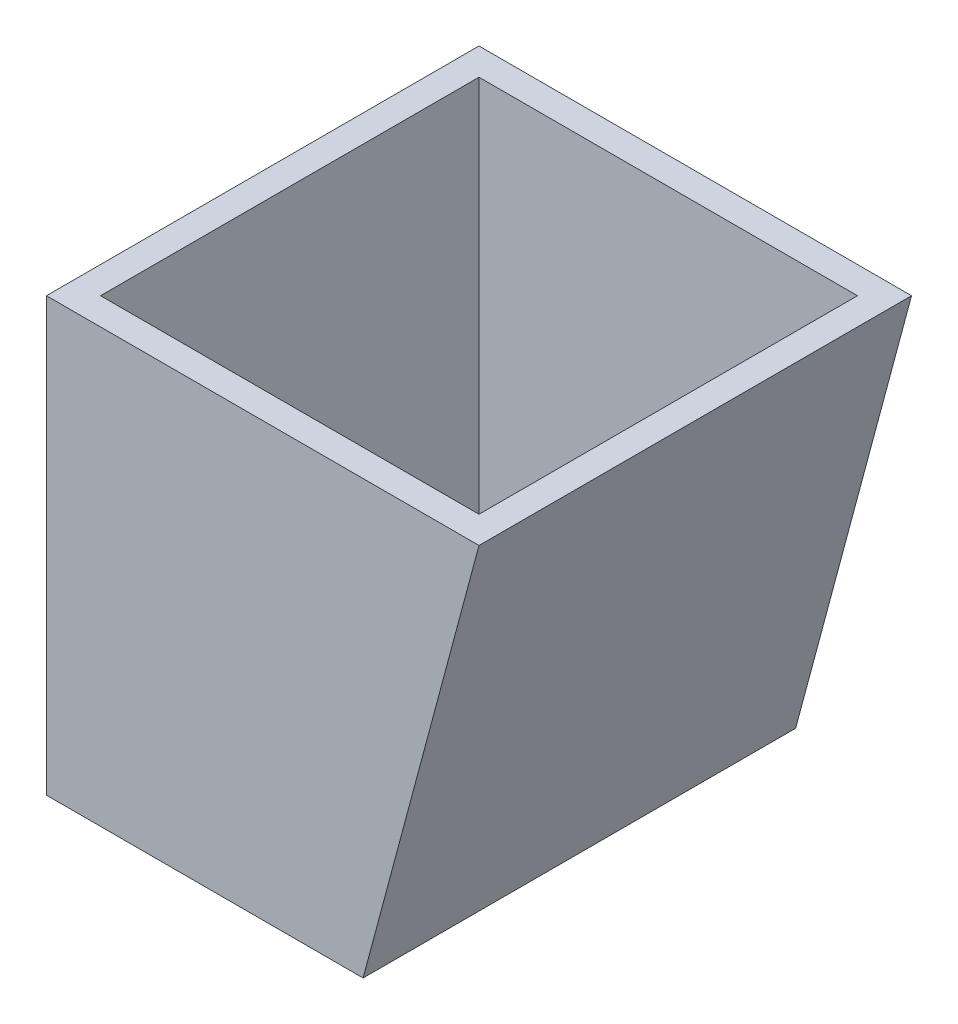
ISO-10303-21;
HEADER;
FILE_DESCRIPTION(('STEP AP214'),'2;1');
FILE_NAME('part.step','',(''),(''),'','','');
FILE_SCHEMA(('AUTOMOTIVE_DESIGN { 1 0 10303 214 1 1 1 1 }'));
ENDSEC;
DATA;
#1=APPLICATION_CONTEXT('core data for automotive mechanical design processes');
#2=APPLICATION_PROTOCOL_DEFINITION('international standard','automotive_design',2000,#1);
#3=PRODUCT_CONTEXT('',#1,'mechanical');
#4=PRODUCT('Part','Part','',(#3));
#5=PRODUCT_RELATED_PRODUCT_CATEGORY('part','',(#4));
#6=PRODUCT_DEFINITION_FORMATION('','',#4);
#7=PRODUCT_DEFINITION_CONTEXT('part definition',#1,'design');
#8=PRODUCT_DEFINITION('design','',#6,#7);
#9=PRODUCT_DEFINITION_SHAPE('','',#8);
#10=(LENGTH_UNIT() NAMED_UNIT(*) SI_UNIT(.MILLI.,.METRE.));
#11=(NAMED_UNIT(*) PLANE_ANGLE_UNIT() SI_UNIT($,.RADIAN.));
#12=(NAMED_UNIT(*) SI_UNIT($,.STERADIAN.) SOLID_ANGLE_UNIT());
#13=UNCERTAINTY_MEASURE_WITH_UNIT(LENGTH_MEASURE(1.E-05),#10,'distance_accuracy_value','');
#14=(GEOMETRIC_REPRESENTATION_CONTEXT(3) GLOBAL_UNCERTAINTY_ASSIGNED_CONTEXT((#13)) GLOBAL_UNIT_ASSIGNED_CONTEXT((#10,
#11,#12)) REPRESENTATION_CONTEXT('',''));
#15=CARTESIAN_POINT('',(0.,0.,0.));
#16=DIRECTION('',(0.,0.,1.));
#17=DIRECTION('',(1.,0.,0.));
#18=AXIS2_PLACEMENT_3D('',#15,#16,#17);
#19=CARTESIAN_POINT('',(-25.4,50.8,-25.4));
#20=DIRECTION('',(0.,0.,1.));
#21=DIRECTION('',(1.,0.,0.));
#22=AXIS2_PLACEMENT_3D('',#19,#20,#21);
#23=PLANE('',#22);
#24=DIRECTION('',(-1.,0.,0.));
#25=VECTOR('',#24,1.);
#26=CARTESIAN_POINT('',(-25.4,50.8,-25.4));
#27=LINE('',#26,#25);
#28=CARTESIAN_POINT('',(25.4,50.8,-25.4));
#29=VERTEX_POINT('',#28);
#30=CARTESIAN_POINT('',(-25.4,50.8,-25.4));
#31=VERTEX_POINT('',#30);
#32=EDGE_CURVE('E145',#29,#31,#27,.T.);
#33=ORIENTED_EDGE('',*,*,#32,.F.);
#34=DIRECTION('',(-0.258819045102521,-0.965925826289068,0.));
#35=VECTOR('',#34,1.);
#36=CARTESIAN_POINT('',(11.7881810244989,0.,-25.4));
#37=LINE('',#36,#35);
#38=CARTESIAN_POINT('',(11.7881810244989,0.,-25.4));
#39=VERTEX_POINT('',#38);
#40=EDGE_CURVE('E134',#29,#39,#37,.T.);
#41=ORIENTED_EDGE('',*,*,#40,.T.);
#42=DIRECTION('',(-1.,0.,0.));
#43=VECTOR('',#42,1.);
#44=CARTESIAN_POINT('',(-25.4,0.,-25.4));
#45=LINE('',#44,#43);
#46=CARTESIAN_POINT('',(-25.4,0.,-25.4));
#47=VERTEX_POINT('',#46);
#48=EDGE_CURVE('E142',#39,#47,#45,.T.);
#49=ORIENTED_EDGE('',*,*,#48,.T.);
#50=DIRECTION('',(0.,-1.,0.));
#51=VECTOR('',#50,1.);
#52=CARTESIAN_POINT('',(-25.4,50.8,-25.4));
#53=LINE('',#52,#51);
#54=EDGE_CURVE('E44',#31,#47,#53,.T.);
#55=ORIENTED_EDGE('',*,*,#54,.F.);
#56=EDGE_LOOP('',(#33,#41,#49,#55));
#57=FACE_BOUND('',#56,.T.);
#58=ADVANCED_FACE('F37',(#57),#23,.F.);
#59=CARTESIAN_POINT('',(-25.4,50.8,-25.4));
#60=DIRECTION('',(1.,0.,0.));
#61=DIRECTION('',(0.,0.,-1.));
#62=AXIS2_PLACEMENT_3D('',#59,#60,#61);
#63=PLANE('',#62);
#64=DIRECTION('',(0.,0.,1.));
#65=VECTOR('',#64,1.);
#66=CARTESIAN_POINT('',(-25.4,0.,-25.4));
#67=LINE('',#66,#65);
#68=CARTESIAN_POINT('',(-25.4,0.,25.4));
#69=VERTEX_POINT('',#68);
#70=EDGE_CURVE('E154',#47,#69,#67,.T.);
#71=ORIENTED_EDGE('',*,*,#70,.T.);
#72=DIRECTION('',(0.,-1.,0.));
#73=VECTOR('',#72,1.);
#74=CARTESIAN_POINT('',(-25.4,50.8,25.4));
#75=LINE('',#74,#73);
#76=CARTESIAN_POINT('',(-25.4,50.8,25.4));
#77=VERTEX_POINT('',#76);
#78=EDGE_CURVE('E152',#77,#69,#75,.T.);
#79=ORIENTED_EDGE('',*,*,#78,.F.);
#80=DIRECTION('',(0.,0.,1.));
#81=VECTOR('',#80,1.);
#82=CARTESIAN_POINT('',(-25.4,50.8,-25.4));
#83=LINE('',#82,#81);
#84=EDGE_CURVE('E148',#31,#77,#83,.T.);
#85=ORIENTED_EDGE('',*,*,#84,.F.);
#86=ORIENTED_EDGE('',*,*,#54,.T.);
#87=EDGE_LOOP('',(#71,#79,#85,#86));
#88=FACE_BOUND('',#87,.T.);
#89=ADVANCED_FACE('F163',(#88),#63,.F.);
#90=CARTESIAN_POINT('',(-25.4,50.8,25.4));
#91=DIRECTION('',(0.,0.,-1.));
#92=DIRECTION('',(-1.,0.,0.));
#93=AXIS2_PLACEMENT_3D('',#90,#91,#92);
#94=PLANE('',#93);
#95=DIRECTION('',(1.,0.,0.));
#96=VECTOR('',#95,1.);
#97=CARTESIAN_POINT('',(-25.4,0.,25.4));
#98=LINE('',#97,#96);
#99=CARTESIAN_POINT('',(11.7881810244989,0.,25.4));
#100=VERTEX_POINT('',#99);
#101=EDGE_CURVE('E146',#69,#100,#98,.T.);
#102=ORIENTED_EDGE('',*,*,#101,.T.);
#103=DIRECTION('',(-0.258819045102521,-0.965925826289068,0.));
#104=VECTOR('',#103,1.);
#105=CARTESIAN_POINT('',(11.7881810244989,0.,25.4));
#106=LINE('',#105,#104);
#107=CARTESIAN_POINT('',(25.4,50.8,25.4));
#108=VERTEX_POINT('',#107);
#109=EDGE_CURVE('E132',#108,#100,#106,.T.);
#110=ORIENTED_EDGE('',*,*,#109,.F.);
#111=DIRECTION('',(1.,0.,0.));
#112=VECTOR('',#111,1.);
#113=CARTESIAN_POINT('',(-25.4,50.8,25.4));
#114=LINE('',#113,#112);
#115=EDGE_CURVE('E150',#77,#108,#114,.T.);
#116=ORIENTED_EDGE('',*,*,#115,.F.);
#117=ORIENTED_EDGE('',*,*,#78,.T.);
#118=EDGE_LOOP('',(#102,#110,#116,#117));
#119=FACE_BOUND('',#118,.T.);
#120=ADVANCED_FACE('F173',(#119),#94,.F.);
#121=CARTESIAN_POINT('',(0.,50.8,0.));
#122=DIRECTION('',(0.,1.,0.));
#123=DIRECTION('',(0.,0.,1.));
#124=AXIS2_PLACEMENT_3D('',#121,#122,#123);
#125=PLANE('',#124);
#126=ORIENTED_EDGE('',*,*,#115,.T.);
#127=DIRECTION('',(0.,0.,-1.));
#128=VECTOR('',#127,1.);
#129=CARTESIAN_POINT('',(25.4,50.8,-25.4));
#130=LINE('',#129,#128);
#131=EDGE_CURVE('E143',#108,#29,#130,.T.);
#132=ORIENTED_EDGE('',*,*,#131,.T.);
#133=ORIENTED_EDGE('',*,*,#32,.T.);
#134=ORIENTED_EDGE('',*,*,#84,.T.);
#135=EDGE_LOOP('',(#126,#132,#133,#134));
#136=FACE_BOUND('',#135,.T.);
#137=DIRECTION('',(0.,0.,-1.));
#138=VECTOR('',#137,1.);
#139=CARTESIAN_POINT('',(22.225,50.8,-22.225));
#140=LINE('',#139,#138);
#141=CARTESIAN_POINT('',(22.225,50.8,22.225));
#142=VERTEX_POINT('',#141);
#143=CARTESIAN_POINT('',(22.225,50.8,-22.225));
#144=VERTEX_POINT('',#143);
#145=EDGE_CURVE('E115',#142,#144,#140,.T.);
#146=ORIENTED_EDGE('',*,*,#145,.F.);
#147=DIRECTION('',(1.,0.,0.));
#148=VECTOR('',#147,1.);
#149=CARTESIAN_POINT('',(-22.225,50.8,22.225));
#150=LINE('',#149,#148);
#151=CARTESIAN_POINT('',(-22.225,50.8,22.225));
#152=VERTEX_POINT('',#151);
#153=EDGE_CURVE('E111',#152,#142,#150,.T.);
#154=ORIENTED_EDGE('',*,*,#153,.F.);
#155=DIRECTION('',(0.,0.,1.));
#156=VECTOR('',#155,1.);
#157=CARTESIAN_POINT('',(-22.225,50.8,-22.225));
#158=LINE('',#157,#156);
#159=CARTESIAN_POINT('',(-22.225,50.8,-22.225));
#160=VERTEX_POINT('',#159);
#161=EDGE_CURVE('E126',#160,#152,#158,.T.);
#162=ORIENTED_EDGE('',*,*,#161,.F.);
#163=DIRECTION('',(-1.,0.,0.));
#164=VECTOR('',#163,1.);
#165=CARTESIAN_POINT('',(-22.225,50.8,-22.225));
#166=LINE('',#165,#164);
#167=EDGE_CURVE('E124',#144,#160,#166,.T.);
#168=ORIENTED_EDGE('',*,*,#167,.F.);
#169=EDGE_LOOP('',(#146,#154,#162,#168));
#170=FACE_BOUND('',#169,.T.);
#171=ADVANCED_FACE('F177',(#136,#170),#125,.T.);
#172=CARTESIAN_POINT('',(0.,0.,0.));
#173=DIRECTION('',(0.,1.,0.));
#174=DIRECTION('',(0.,0.,1.));
#175=AXIS2_PLACEMENT_3D('',#172,#173,#174);
#176=PLANE('',#175);
#177=DIRECTION('',(0.,0.,1.));
#178=VECTOR('',#177,1.);
#179=CARTESIAN_POINT('',(11.7881810244989,0.,-25.4));
#180=LINE('',#179,#178);
#181=EDGE_CURVE('E137',#39,#100,#180,.T.);
#182=ORIENTED_EDGE('',*,*,#181,.T.);
#183=ORIENTED_EDGE('',*,*,#101,.F.);
#184=ORIENTED_EDGE('',*,*,#70,.F.);
#185=ORIENTED_EDGE('',*,*,#48,.F.);
#186=EDGE_LOOP('',(#182,#183,#184,#185));
#187=FACE_BOUND('',#186,.T.);
#188=ADVANCED_FACE('F170',(#187),#176,.F.);
#189=CARTESIAN_POINT('',(11.7881810244989,0.,-25.4));
#190=DIRECTION('',(-0.965925826289068,0.258819045102521,0.));
#191=DIRECTION('',(-0.258819045102521,-0.965925826289068,0.));
#192=AXIS2_PLACEMENT_3D('',#189,#190,#191);
#193=PLANE('',#192);
#194=ORIENTED_EDGE('',*,*,#40,.F.);
#195=ORIENTED_EDGE('',*,*,#131,.F.);
#196=ORIENTED_EDGE('',*,*,#109,.T.);
#197=ORIENTED_EDGE('',*,*,#181,.F.);
#198=EDGE_LOOP('',(#194,#195,#196,#197));
#199=FACE_BOUND('',#198,.T.);
#200=ADVANCED_FACE('F181',(#199),#193,.F.);
#201=CARTESIAN_POINT('',(-22.225,3.175,22.225));
#202=DIRECTION('',(0.,0.,1.));
#203=DIRECTION('',(1.,0.,0.));
#204=AXIS2_PLACEMENT_3D('',#201,#202,#203);
#205=PLANE('',#204);
#206=ORIENTED_EDGE('',*,*,#153,.T.);
#207=DIRECTION('',(-0.258819045102521,-0.965925826289068,0.));
#208=VECTOR('',#207,1.);
#209=CARTESIAN_POINT('',(7.34116459910912,-4.74722992761695,22.225));
#210=LINE('',#209,#208);
#211=CARTESIAN_POINT('',(9.46391971046776,3.175,22.225));
#212=VERTEX_POINT('',#211);
#213=EDGE_CURVE('E108',#142,#212,#210,.T.);
#214=ORIENTED_EDGE('',*,*,#213,.T.);
#215=DIRECTION('',(1.,0.,0.));
#216=VECTOR('',#215,1.);
#217=CARTESIAN_POINT('',(-22.225,3.175,22.225));
#218=LINE('',#217,#216);
#219=CARTESIAN_POINT('',(-22.225,3.175,22.225));
#220=VERTEX_POINT('',#219);
#221=EDGE_CURVE('E99',#220,#212,#218,.T.);
#222=ORIENTED_EDGE('',*,*,#221,.F.);
#223=DIRECTION('',(0.,1.,0.));
#224=VECTOR('',#223,1.);
#225=CARTESIAN_POINT('',(-22.225,3.175,22.225));
#226=LINE('',#225,#224);
#227=EDGE_CURVE('E130',#220,#152,#226,.T.);
#228=ORIENTED_EDGE('',*,*,#227,.T.);
#229=EDGE_LOOP('',(#206,#214,#222,#228));
#230=FACE_BOUND('',#229,.T.);
#231=ADVANCED_FACE('F109',(#230),#205,.F.);
#232=CARTESIAN_POINT('',(-22.225,3.175,-22.225));
#233=DIRECTION('',(0.,0.,-1.));
#234=DIRECTION('',(-1.,0.,0.));
#235=AXIS2_PLACEMENT_3D('',#232,#233,#234);
#236=PLANE('',#235);
#237=DIRECTION('',(-1.,0.,0.));
#238=VECTOR('',#237,1.);
#239=CARTESIAN_POINT('',(-22.225,3.175,-22.225));
#240=LINE('',#239,#238);
#241=CARTESIAN_POINT('',(9.46391971046776,3.175,-22.225));
#242=VERTEX_POINT('',#241);
#243=CARTESIAN_POINT('',(-22.225,3.175,-22.225));
#244=VERTEX_POINT('',#243);
#245=EDGE_CURVE('E120',#242,#244,#240,.T.);
#246=ORIENTED_EDGE('',*,*,#245,.F.);
#247=DIRECTION('',(-0.258819045102521,-0.965925826289068,0.));
#248=VECTOR('',#247,1.);
#249=CARTESIAN_POINT('',(22.225,50.8,-22.225));
#250=LINE('',#249,#248);
#251=EDGE_CURVE('E56',#144,#242,#250,.T.);
#252=ORIENTED_EDGE('',*,*,#251,.F.);
#253=ORIENTED_EDGE('',*,*,#167,.T.);
#254=DIRECTION('',(0.,1.,0.));
#255=VECTOR('',#254,1.);
#256=CARTESIAN_POINT('',(-22.225,3.175,-22.225));
#257=LINE('',#256,#255);
#258=EDGE_CURVE('E105',#244,#160,#257,.T.);
#259=ORIENTED_EDGE('',*,*,#258,.F.);
#260=EDGE_LOOP('',(#246,#252,#253,#259));
#261=FACE_BOUND('',#260,.T.);
#262=ADVANCED_FACE('F197',(#261),#236,.F.);
#263=CARTESIAN_POINT('',(0.,3.175,0.));
#264=DIRECTION('',(0.,1.,0.));
#265=DIRECTION('',(0.,0.,1.));
#266=AXIS2_PLACEMENT_3D('',#263,#264,#265);
#267=PLANE('',#266);
#268=DIRECTION('',(0.,0.,1.));
#269=VECTOR('',#268,1.);
#270=CARTESIAN_POINT('',(9.46391971046776,3.175,0.));
#271=LINE('',#270,#269);
#272=EDGE_CURVE('E11',#242,#212,#271,.T.);
#273=ORIENTED_EDGE('',*,*,#272,.F.);
#274=ORIENTED_EDGE('',*,*,#245,.T.);
#275=DIRECTION('',(0.,0.,1.));
#276=VECTOR('',#275,1.);
#277=CARTESIAN_POINT('',(-22.225,3.175,-22.225));
#278=LINE('',#277,#276);
#279=EDGE_CURVE('E103',#244,#220,#278,.T.);
#280=ORIENTED_EDGE('',*,*,#279,.T.);
#281=ORIENTED_EDGE('',*,*,#221,.T.);
#282=EDGE_LOOP('',(#273,#274,#280,#281));
#283=FACE_BOUND('',#282,.T.);
#284=ADVANCED_FACE('F101',(#283),#267,.T.);
#285=CARTESIAN_POINT('',(-22.225,3.175,-22.225));
#286=DIRECTION('',(-1.,0.,0.));
#287=DIRECTION('',(0.,0.,1.));
#288=AXIS2_PLACEMENT_3D('',#285,#286,#287);
#289=PLANE('',#288);
#290=ORIENTED_EDGE('',*,*,#161,.T.);
#291=ORIENTED_EDGE('',*,*,#227,.F.);
#292=ORIENTED_EDGE('',*,*,#279,.F.);
#293=ORIENTED_EDGE('',*,*,#258,.T.);
#294=EDGE_LOOP('',(#290,#291,#292,#293));
#295=FACE_BOUND('',#294,.T.);
#296=ADVANCED_FACE('F200',(#295),#289,.F.);
#297=CARTESIAN_POINT('',(22.225,50.8,-22.225));
#298=DIRECTION('',(-0.965925826289068,0.258819045102521,0.));
#299=DIRECTION('',(-0.258819045102521,-0.965925826289068,0.));
#300=AXIS2_PLACEMENT_3D('',#297,#298,#299);
#301=PLANE('',#300);
#302=ORIENTED_EDGE('',*,*,#213,.F.);
#303=ORIENTED_EDGE('',*,*,#145,.T.);
#304=ORIENTED_EDGE('',*,*,#251,.T.);
#305=ORIENTED_EDGE('',*,*,#272,.T.);
#306=EDGE_LOOP('',(#302,#303,#304,#305));
#307=FACE_BOUND('',#306,.T.);
#308=ADVANCED_FACE('F117',(#307),#301,.T.);
#309=CLOSED_SHELL('',(#58,#89,#120,#171,#188,#200,#231,#262,#284,#296,#308));
#310=MANIFOLD_SOLID_BREP('B2',#309);
#311=ADVANCED_BREP_SHAPE_REPRESENTATION('',(#18,#310),#14);
#312=SHAPE_DEFINITION_REPRESENTATION(#9,#311);
ENDSEC;
END-ISO-10303-21;
